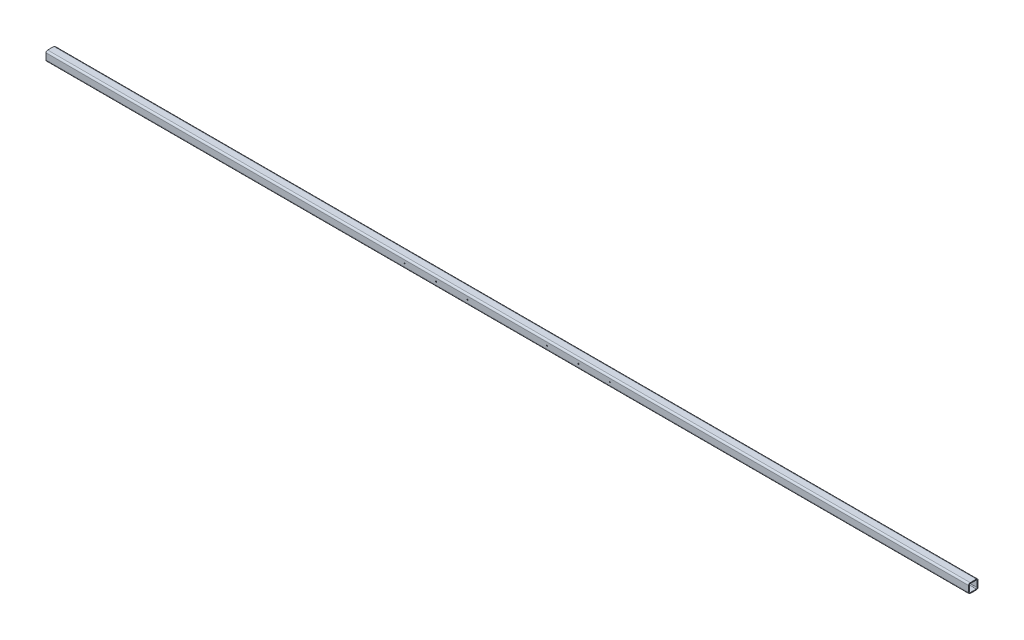
ISO-10303-21;
HEADER;
FILE_DESCRIPTION(('STEP AP214'),'2;1');
FILE_NAME('part.step','',(''),(''),'','','');
FILE_SCHEMA(('AUTOMOTIVE_DESIGN { 1 0 10303 214 1 1 1 1 }'));
ENDSEC;
DATA;
#1=APPLICATION_CONTEXT('core data for automotive mechanical design processes');
#2=APPLICATION_PROTOCOL_DEFINITION('international standard','automotive_design',2000,#1);
#3=PRODUCT_CONTEXT('',#1,'mechanical');
#4=PRODUCT('Part','Part','',(#3));
#5=PRODUCT_RELATED_PRODUCT_CATEGORY('part','',(#4));
#6=PRODUCT_DEFINITION_FORMATION('','',#4);
#7=PRODUCT_DEFINITION_CONTEXT('part definition',#1,'design');
#8=PRODUCT_DEFINITION('design','',#6,#7);
#9=PRODUCT_DEFINITION_SHAPE('','',#8);
#10=(LENGTH_UNIT() NAMED_UNIT(*) SI_UNIT(.MILLI.,.METRE.));
#11=(NAMED_UNIT(*) PLANE_ANGLE_UNIT() SI_UNIT($,.RADIAN.));
#12=(NAMED_UNIT(*) SI_UNIT($,.STERADIAN.) SOLID_ANGLE_UNIT());
#13=UNCERTAINTY_MEASURE_WITH_UNIT(LENGTH_MEASURE(1.E-05),#10,'distance_accuracy_value','');
#14=(GEOMETRIC_REPRESENTATION_CONTEXT(3) GLOBAL_UNCERTAINTY_ASSIGNED_CONTEXT((#13)) GLOBAL_UNIT_ASSIGNED_CONTEXT((#10,
#11,#12)) REPRESENTATION_CONTEXT('',''));
#15=CARTESIAN_POINT('',(0.,0.,0.));
#16=DIRECTION('',(0.,0.,1.));
#17=DIRECTION('',(1.,0.,0.));
#18=AXIS2_PLACEMENT_3D('',#15,#16,#17);
#19=CARTESIAN_POINT('',(2932.,9.8,9.8));
#20=DIRECTION('',(-1.,0.,0.));
#21=DIRECTION('',(0.,0.,1.));
#22=AXIS2_PLACEMENT_3D('',#19,#20,#21);
#23=CYLINDRICAL_SURFACE('',#22,5.2);
#24=CARTESIAN_POINT('',(0.,9.8,9.8));
#25=DIRECTION('',(1.,0.,0.));
#26=DIRECTION('',(0.,0.,-1.));
#27=AXIS2_PLACEMENT_3D('',#24,#25,#26);
#28=CIRCLE('',#27,5.2);
#29=CARTESIAN_POINT('',(0.,15.,9.8));
#30=VERTEX_POINT('',#29);
#31=CARTESIAN_POINT('',(0.,9.8,15.));
#32=VERTEX_POINT('',#31);
#33=EDGE_CURVE('E239',#30,#32,#28,.T.);
#34=ORIENTED_EDGE('',*,*,#33,.T.);
#35=DIRECTION('',(-1.,0.,0.));
#36=VECTOR('',#35,1.);
#37=CARTESIAN_POINT('',(2932.,9.8,15.));
#38=LINE('',#37,#36);
#39=CARTESIAN_POINT('',(2932.,9.8,15.));
#40=VERTEX_POINT('',#39);
#41=EDGE_CURVE('E12',#40,#32,#38,.T.);
#42=ORIENTED_EDGE('',*,*,#41,.F.);
#43=CARTESIAN_POINT('',(2932.,9.8,9.8));
#44=DIRECTION('',(1.,0.,0.));
#45=DIRECTION('',(0.,0.,-1.));
#46=AXIS2_PLACEMENT_3D('',#43,#44,#45);
#47=CIRCLE('',#46,5.2);
#48=CARTESIAN_POINT('',(2932.,15.,9.8));
#49=VERTEX_POINT('',#48);
#50=EDGE_CURVE('E361',#49,#40,#47,.T.);
#51=ORIENTED_EDGE('',*,*,#50,.F.);
#52=DIRECTION('',(-1.,0.,0.));
#53=VECTOR('',#52,1.);
#54=CARTESIAN_POINT('',(2932.,15.,9.8));
#55=LINE('',#54,#53);
#56=EDGE_CURVE('E254',#49,#30,#55,.T.);
#57=ORIENTED_EDGE('',*,*,#56,.T.);
#58=EDGE_LOOP('',(#34,#42,#51,#57));
#59=FACE_BOUND('',#58,.T.);
#60=ADVANCED_FACE('F65',(#59),#23,.T.);
#61=CARTESIAN_POINT('',(2932.,9.8,15.));
#62=DIRECTION('',(0.,0.,-1.));
#63=DIRECTION('',(-1.,0.,0.));
#64=AXIS2_PLACEMENT_3D('',#61,#62,#63);
#65=PLANE('',#64);
#66=CARTESIAN_POINT('',(1139.95,0.,15.));
#67=DIRECTION('',(0.,0.,1.));
#68=DIRECTION('',(1.,0.,0.));
#69=AXIS2_PLACEMENT_3D('',#66,#67,#68);
#70=CIRCLE('',#69,1.64999999999993);
#71=CARTESIAN_POINT('',(1141.6,0.,15.));
#72=VERTEX_POINT('',#71);
#73=EDGE_CURVE('E303',#72,#72,#70,.T.);
#74=ORIENTED_EDGE('',*,*,#73,.F.);
#75=EDGE_LOOP('',(#74));
#76=FACE_BOUND('',#75,.T.);
#77=CARTESIAN_POINT('',(1239.95,0.,15.));
#78=DIRECTION('',(0.,0.,1.));
#79=DIRECTION('',(1.,0.,0.));
#80=AXIS2_PLACEMENT_3D('',#77,#78,#79);
#81=CIRCLE('',#80,1.64999999999993);
#82=CARTESIAN_POINT('',(1241.6,0.,15.));
#83=VERTEX_POINT('',#82);
#84=EDGE_CURVE('E292',#83,#83,#81,.T.);
#85=ORIENTED_EDGE('',*,*,#84,.F.);
#86=EDGE_LOOP('',(#85));
#87=FACE_BOUND('',#86,.T.);
#88=CARTESIAN_POINT('',(1339.95,0.,15.));
#89=DIRECTION('',(0.,0.,1.));
#90=DIRECTION('',(1.,0.,0.));
#91=AXIS2_PLACEMENT_3D('',#88,#89,#90);
#92=CIRCLE('',#91,1.64999999999993);
#93=CARTESIAN_POINT('',(1341.6,0.,15.));
#94=VERTEX_POINT('',#93);
#95=EDGE_CURVE('E291',#94,#94,#92,.T.);
#96=ORIENTED_EDGE('',*,*,#95,.F.);
#97=EDGE_LOOP('',(#96));
#98=FACE_BOUND('',#97,.T.);
#99=CARTESIAN_POINT('',(1592.05,0.,15.));
#100=DIRECTION('',(0.,0.,1.));
#101=DIRECTION('',(1.,0.,0.));
#102=AXIS2_PLACEMENT_3D('',#99,#100,#101);
#103=CIRCLE('',#102,1.64999999999993);
#104=CARTESIAN_POINT('',(1593.7,0.,15.));
#105=VERTEX_POINT('',#104);
#106=EDGE_CURVE('E308',#105,#105,#103,.T.);
#107=ORIENTED_EDGE('',*,*,#106,.F.);
#108=EDGE_LOOP('',(#107));
#109=FACE_BOUND('',#108,.T.);
#110=CARTESIAN_POINT('',(1692.05,0.,15.));
#111=DIRECTION('',(0.,0.,1.));
#112=DIRECTION('',(1.,0.,0.));
#113=AXIS2_PLACEMENT_3D('',#110,#111,#112);
#114=CIRCLE('',#113,1.64999999999993);
#115=CARTESIAN_POINT('',(1693.7,0.,15.));
#116=VERTEX_POINT('',#115);
#117=EDGE_CURVE('E314',#116,#116,#114,.T.);
#118=ORIENTED_EDGE('',*,*,#117,.F.);
#119=EDGE_LOOP('',(#118));
#120=FACE_BOUND('',#119,.T.);
#121=CARTESIAN_POINT('',(1792.05,0.,15.));
#122=DIRECTION('',(0.,0.,1.));
#123=DIRECTION('',(1.,0.,0.));
#124=AXIS2_PLACEMENT_3D('',#121,#122,#123);
#125=CIRCLE('',#124,1.64999999999993);
#126=CARTESIAN_POINT('',(1793.7,0.,15.));
#127=VERTEX_POINT('',#126);
#128=EDGE_CURVE('E320',#127,#127,#125,.T.);
#129=ORIENTED_EDGE('',*,*,#128,.F.);
#130=EDGE_LOOP('',(#129));
#131=FACE_BOUND('',#130,.T.);
#132=DIRECTION('',(0.,-1.,0.));
#133=VECTOR('',#132,1.);
#134=CARTESIAN_POINT('',(0.,9.8,15.));
#135=LINE('',#134,#133);
#136=CARTESIAN_POINT('',(0.,-9.8,15.));
#137=VERTEX_POINT('',#136);
#138=EDGE_CURVE('E242',#32,#137,#135,.T.);
#139=ORIENTED_EDGE('',*,*,#138,.T.);
#140=DIRECTION('',(-1.,0.,0.));
#141=VECTOR('',#140,1.);
#142=CARTESIAN_POINT('',(2932.,-9.8,15.));
#143=LINE('',#142,#141);
#144=CARTESIAN_POINT('',(2932.,-9.8,15.));
#145=VERTEX_POINT('',#144);
#146=EDGE_CURVE('E75',#145,#137,#143,.T.);
#147=ORIENTED_EDGE('',*,*,#146,.F.);
#148=DIRECTION('',(0.,-1.,0.));
#149=VECTOR('',#148,1.);
#150=CARTESIAN_POINT('',(2932.,9.8,15.));
#151=LINE('',#150,#149);
#152=EDGE_CURVE('E363',#40,#145,#151,.T.);
#153=ORIENTED_EDGE('',*,*,#152,.F.);
#154=ORIENTED_EDGE('',*,*,#41,.T.);
#155=EDGE_LOOP('',(#139,#147,#153,#154));
#156=FACE_BOUND('',#155,.T.);
#157=ADVANCED_FACE('F401',(#76,#87,#98,#109,#120,#131,#156),#65,.F.);
#158=CARTESIAN_POINT('',(2932.,-9.8,9.8));
#159=DIRECTION('',(-1.,0.,0.));
#160=DIRECTION('',(0.,0.,1.));
#161=AXIS2_PLACEMENT_3D('',#158,#159,#160);
#162=CYLINDRICAL_SURFACE('',#161,5.2);
#163=CARTESIAN_POINT('',(0.,-9.8,9.8));
#164=DIRECTION('',(1.,0.,0.));
#165=DIRECTION('',(0.,0.,-1.));
#166=AXIS2_PLACEMENT_3D('',#163,#164,#165);
#167=CIRCLE('',#166,5.2);
#168=CARTESIAN_POINT('',(0.,-15.,9.8));
#169=VERTEX_POINT('',#168);
#170=EDGE_CURVE('E244',#137,#169,#167,.T.);
#171=ORIENTED_EDGE('',*,*,#170,.T.);
#172=DIRECTION('',(-1.,0.,0.));
#173=VECTOR('',#172,1.);
#174=CARTESIAN_POINT('',(2932.,-15.,9.8));
#175=LINE('',#174,#173);
#176=CARTESIAN_POINT('',(2932.,-15.,9.8));
#177=VERTEX_POINT('',#176);
#178=EDGE_CURVE('E261',#177,#169,#175,.T.);
#179=ORIENTED_EDGE('',*,*,#178,.F.);
#180=CARTESIAN_POINT('',(2932.,-9.8,9.8));
#181=DIRECTION('',(1.,0.,0.));
#182=DIRECTION('',(0.,0.,-1.));
#183=AXIS2_PLACEMENT_3D('',#180,#181,#182);
#184=CIRCLE('',#183,5.2);
#185=EDGE_CURVE('E365',#145,#177,#184,.T.);
#186=ORIENTED_EDGE('',*,*,#185,.F.);
#187=ORIENTED_EDGE('',*,*,#146,.T.);
#188=EDGE_LOOP('',(#171,#179,#186,#187));
#189=FACE_BOUND('',#188,.T.);
#190=ADVANCED_FACE('F406',(#189),#162,.T.);
#191=CARTESIAN_POINT('',(2932.,-15.,-9.8));
#192=DIRECTION('',(0.,1.,0.));
#193=DIRECTION('',(0.,0.,1.));
#194=AXIS2_PLACEMENT_3D('',#191,#192,#193);
#195=PLANE('',#194);
#196=CARTESIAN_POINT('',(20.9500000000001,-15.,0.));
#197=DIRECTION('',(0.,-1.,0.));
#198=DIRECTION('',(0.,0.,-1.));
#199=AXIS2_PLACEMENT_3D('',#196,#197,#198);
#200=CIRCLE('',#199,1.64999999999999);
#201=CARTESIAN_POINT('',(20.9500000000001,-15.,-1.64999999999999));
#202=VERTEX_POINT('',#201);
#203=EDGE_CURVE('E288',#202,#202,#200,.T.);
#204=ORIENTED_EDGE('',*,*,#203,.F.);
#205=EDGE_LOOP('',(#204));
#206=FACE_BOUND('',#205,.T.);
#207=CARTESIAN_POINT('',(50.9500000000001,-15.,0.));
#208=DIRECTION('',(0.,-1.,0.));
#209=DIRECTION('',(0.,0.,-1.));
#210=AXIS2_PLACEMENT_3D('',#207,#208,#209);
#211=CIRCLE('',#210,1.64999999999999);
#212=CARTESIAN_POINT('',(50.9500000000001,-15.,-1.64999999999999));
#213=VERTEX_POINT('',#212);
#214=EDGE_CURVE('E287',#213,#213,#211,.T.);
#215=ORIENTED_EDGE('',*,*,#214,.F.);
#216=EDGE_LOOP('',(#215));
#217=FACE_BOUND('',#216,.T.);
#218=CARTESIAN_POINT('',(2881.05,-15.,3.46587290626692E-13));
#219=DIRECTION('',(0.,-1.,0.));
#220=DIRECTION('',(0.,0.,-1.));
#221=AXIS2_PLACEMENT_3D('',#218,#219,#220);
#222=CIRCLE('',#221,1.65000000000015);
#223=CARTESIAN_POINT('',(2881.05,-15.,-1.6499999999998));
#224=VERTEX_POINT('',#223);
#225=EDGE_CURVE('E284',#224,#224,#222,.T.);
#226=ORIENTED_EDGE('',*,*,#225,.F.);
#227=EDGE_LOOP('',(#226));
#228=FACE_BOUND('',#227,.T.);
#229=CARTESIAN_POINT('',(2911.05,-15.,3.53935171421577E-13));
#230=DIRECTION('',(0.,-1.,0.));
#231=DIRECTION('',(0.,0.,-1.));
#232=AXIS2_PLACEMENT_3D('',#229,#230,#231);
#233=CIRCLE('',#232,1.65000000000015);
#234=CARTESIAN_POINT('',(2911.05,-15.,-1.6499999999998));
#235=VERTEX_POINT('',#234);
#236=EDGE_CURVE('E283',#235,#235,#233,.T.);
#237=ORIENTED_EDGE('',*,*,#236,.F.);
#238=EDGE_LOOP('',(#237));
#239=FACE_BOUND('',#238,.T.);
#240=DIRECTION('',(0.,0.,-1.));
#241=VECTOR('',#240,1.);
#242=CARTESIAN_POINT('',(0.,-15.,-9.8));
#243=LINE('',#242,#241);
#244=CARTESIAN_POINT('',(0.,-15.,-9.8));
#245=VERTEX_POINT('',#244);
#246=EDGE_CURVE('E246',#169,#245,#243,.T.);
#247=ORIENTED_EDGE('',*,*,#246,.T.);
#248=DIRECTION('',(-1.,0.,0.));
#249=VECTOR('',#248,1.);
#250=CARTESIAN_POINT('',(2932.,-15.,-9.8));
#251=LINE('',#250,#249);
#252=CARTESIAN_POINT('',(2932.,-15.,-9.8));
#253=VERTEX_POINT('',#252);
#254=EDGE_CURVE('E258',#253,#245,#251,.T.);
#255=ORIENTED_EDGE('',*,*,#254,.F.);
#256=DIRECTION('',(0.,0.,-1.));
#257=VECTOR('',#256,1.);
#258=CARTESIAN_POINT('',(2932.,-15.,-9.8));
#259=LINE('',#258,#257);
#260=EDGE_CURVE('E367',#177,#253,#259,.T.);
#261=ORIENTED_EDGE('',*,*,#260,.F.);
#262=ORIENTED_EDGE('',*,*,#178,.T.);
#263=EDGE_LOOP('',(#247,#255,#261,#262));
#264=FACE_BOUND('',#263,.T.);
#265=ADVANCED_FACE('F373',(#206,#217,#228,#239,#264),#195,.F.);
#266=CARTESIAN_POINT('',(2932.,-9.8,-9.8));
#267=DIRECTION('',(-1.,0.,0.));
#268=DIRECTION('',(0.,0.,1.));
#269=AXIS2_PLACEMENT_3D('',#266,#267,#268);
#270=CYLINDRICAL_SURFACE('',#269,5.2);
#271=CARTESIAN_POINT('',(0.,-9.8,-9.8));
#272=DIRECTION('',(1.,0.,0.));
#273=DIRECTION('',(0.,0.,-1.));
#274=AXIS2_PLACEMENT_3D('',#271,#272,#273);
#275=CIRCLE('',#274,5.2);
#276=CARTESIAN_POINT('',(0.,-9.8,-15.));
#277=VERTEX_POINT('',#276);
#278=EDGE_CURVE('E248',#245,#277,#275,.T.);
#279=ORIENTED_EDGE('',*,*,#278,.T.);
#280=DIRECTION('',(-1.,0.,0.));
#281=VECTOR('',#280,1.);
#282=CARTESIAN_POINT('',(2932.,-9.8,-15.));
#283=LINE('',#282,#281);
#284=CARTESIAN_POINT('',(2932.,-9.8,-15.));
#285=VERTEX_POINT('',#284);
#286=EDGE_CURVE('E205',#285,#277,#283,.T.);
#287=ORIENTED_EDGE('',*,*,#286,.F.);
#288=CARTESIAN_POINT('',(2932.,-9.8,-9.8));
#289=DIRECTION('',(1.,0.,0.));
#290=DIRECTION('',(0.,0.,-1.));
#291=AXIS2_PLACEMENT_3D('',#288,#289,#290);
#292=CIRCLE('',#291,5.2);
#293=EDGE_CURVE('E196',#253,#285,#292,.T.);
#294=ORIENTED_EDGE('',*,*,#293,.F.);
#295=ORIENTED_EDGE('',*,*,#254,.T.);
#296=EDGE_LOOP('',(#279,#287,#294,#295));
#297=FACE_BOUND('',#296,.T.);
#298=ADVANCED_FACE('F377',(#297),#270,.T.);
#299=CARTESIAN_POINT('',(2932.,-9.8,-15.));
#300=DIRECTION('',(0.,0.,1.));
#301=DIRECTION('',(1.,0.,0.));
#302=AXIS2_PLACEMENT_3D('',#299,#300,#301);
#303=PLANE('',#302);
#304=DIRECTION('',(0.,1.,0.));
#305=VECTOR('',#304,1.);
#306=CARTESIAN_POINT('',(0.,-9.8,-15.));
#307=LINE('',#306,#305);
#308=CARTESIAN_POINT('',(0.,9.8,-15.));
#309=VERTEX_POINT('',#308);
#310=EDGE_CURVE('E204',#277,#309,#307,.T.);
#311=ORIENTED_EDGE('',*,*,#310,.T.);
#312=DIRECTION('',(-1.,0.,0.));
#313=VECTOR('',#312,1.);
#314=CARTESIAN_POINT('',(2932.,9.8,-15.));
#315=LINE('',#314,#313);
#316=CARTESIAN_POINT('',(2932.,9.8,-15.));
#317=VERTEX_POINT('',#316);
#318=EDGE_CURVE('E201',#317,#309,#315,.T.);
#319=ORIENTED_EDGE('',*,*,#318,.F.);
#320=DIRECTION('',(0.,1.,0.));
#321=VECTOR('',#320,1.);
#322=CARTESIAN_POINT('',(2932.,-9.8,-15.));
#323=LINE('',#322,#321);
#324=EDGE_CURVE('E190',#285,#317,#323,.T.);
#325=ORIENTED_EDGE('',*,*,#324,.F.);
#326=ORIENTED_EDGE('',*,*,#286,.T.);
#327=EDGE_LOOP('',(#311,#319,#325,#326));
#328=FACE_BOUND('',#327,.T.);
#329=ADVANCED_FACE('F202',(#328),#303,.F.);
#330=CARTESIAN_POINT('',(2932.,9.8,-9.8));
#331=DIRECTION('',(-1.,0.,0.));
#332=DIRECTION('',(0.,0.,1.));
#333=AXIS2_PLACEMENT_3D('',#330,#331,#332);
#334=CYLINDRICAL_SURFACE('',#333,5.2);
#335=CARTESIAN_POINT('',(0.,9.8,-9.8));
#336=DIRECTION('',(1.,0.,0.));
#337=DIRECTION('',(0.,0.,-1.));
#338=AXIS2_PLACEMENT_3D('',#335,#336,#337);
#339=CIRCLE('',#338,5.2);
#340=CARTESIAN_POINT('',(0.,15.,-9.8));
#341=VERTEX_POINT('',#340);
#342=EDGE_CURVE('E137',#309,#341,#339,.T.);
#343=ORIENTED_EDGE('',*,*,#342,.T.);
#344=DIRECTION('',(-1.,0.,0.));
#345=VECTOR('',#344,1.);
#346=CARTESIAN_POINT('',(2932.,15.,-9.8));
#347=LINE('',#346,#345);
#348=CARTESIAN_POINT('',(2932.,15.,-9.8));
#349=VERTEX_POINT('',#348);
#350=EDGE_CURVE('E206',#349,#341,#347,.T.);
#351=ORIENTED_EDGE('',*,*,#350,.F.);
#352=CARTESIAN_POINT('',(2932.,9.8,-9.8));
#353=DIRECTION('',(1.,0.,0.));
#354=DIRECTION('',(0.,0.,-1.));
#355=AXIS2_PLACEMENT_3D('',#352,#353,#354);
#356=CIRCLE('',#355,5.2);
#357=EDGE_CURVE('E194',#317,#349,#356,.T.);
#358=ORIENTED_EDGE('',*,*,#357,.F.);
#359=ORIENTED_EDGE('',*,*,#318,.T.);
#360=EDGE_LOOP('',(#343,#351,#358,#359));
#361=FACE_BOUND('',#360,.T.);
#362=ADVANCED_FACE('F208',(#361),#334,.T.);
#363=CARTESIAN_POINT('',(2932.,-9.8,9.8));
#364=DIRECTION('',(-1.,0.,0.));
#365=DIRECTION('',(0.,0.,1.));
#366=AXIS2_PLACEMENT_3D('',#363,#364,#365);
#367=CYLINDRICAL_SURFACE('',#366,2.6);
#368=CARTESIAN_POINT('',(0.,-9.8,9.8));
#369=DIRECTION('',(1.,0.,0.));
#370=DIRECTION('',(0.,0.,-1.));
#371=AXIS2_PLACEMENT_3D('',#368,#369,#370);
#372=CIRCLE('',#371,2.6);
#373=CARTESIAN_POINT('',(0.,-9.8,12.4));
#374=VERTEX_POINT('',#373);
#375=CARTESIAN_POINT('',(0.,-12.4,9.8));
#376=VERTEX_POINT('',#375);
#377=EDGE_CURVE('E214',#374,#376,#372,.T.);
#378=ORIENTED_EDGE('',*,*,#377,.F.);
#379=DIRECTION('',(-1.,0.,0.));
#380=VECTOR('',#379,1.);
#381=CARTESIAN_POINT('',(2932.,-9.8,12.4));
#382=LINE('',#381,#380);
#383=CARTESIAN_POINT('',(2932.,-9.8,12.4));
#384=VERTEX_POINT('',#383);
#385=EDGE_CURVE('E151',#384,#374,#382,.T.);
#386=ORIENTED_EDGE('',*,*,#385,.F.);
#387=CARTESIAN_POINT('',(2932.,-9.8,9.8));
#388=DIRECTION('',(1.,0.,0.));
#389=DIRECTION('',(0.,0.,-1.));
#390=AXIS2_PLACEMENT_3D('',#387,#388,#389);
#391=CIRCLE('',#390,2.6);
#392=CARTESIAN_POINT('',(2932.,-12.4,9.8));
#393=VERTEX_POINT('',#392);
#394=EDGE_CURVE('E253',#384,#393,#391,.T.);
#395=ORIENTED_EDGE('',*,*,#394,.T.);
#396=DIRECTION('',(-1.,0.,0.));
#397=VECTOR('',#396,1.);
#398=CARTESIAN_POINT('',(2932.,-12.4,9.8));
#399=LINE('',#398,#397);
#400=EDGE_CURVE('E210',#393,#376,#399,.T.);
#401=ORIENTED_EDGE('',*,*,#400,.T.);
#402=EDGE_LOOP('',(#378,#386,#395,#401));
#403=FACE_BOUND('',#402,.T.);
#404=ADVANCED_FACE('F67',(#403),#367,.F.);
#405=CARTESIAN_POINT('',(2932.,9.8,12.4));
#406=DIRECTION('',(0.,0.,-1.));
#407=DIRECTION('',(-1.,0.,0.));
#408=AXIS2_PLACEMENT_3D('',#405,#406,#407);
#409=PLANE('',#408);
#410=CARTESIAN_POINT('',(1139.95,0.,12.4));
#411=DIRECTION('',(0.,0.,-1.));
#412=DIRECTION('',(-1.,0.,0.));
#413=AXIS2_PLACEMENT_3D('',#410,#411,#412);
#414=CIRCLE('',#413,1.64999999999993);
#415=CARTESIAN_POINT('',(1138.3,0.,12.4));
#416=VERTEX_POINT('',#415);
#417=EDGE_CURVE('E69',#416,#416,#414,.T.);
#418=ORIENTED_EDGE('',*,*,#417,.F.);
#419=EDGE_LOOP('',(#418));
#420=FACE_BOUND('',#419,.T.);
#421=CARTESIAN_POINT('',(1239.95,0.,12.4));
#422=DIRECTION('',(0.,0.,-1.));
#423=DIRECTION('',(-1.,0.,0.));
#424=AXIS2_PLACEMENT_3D('',#421,#422,#423);
#425=CIRCLE('',#424,1.64999999999993);
#426=CARTESIAN_POINT('',(1238.3,0.,12.4));
#427=VERTEX_POINT('',#426);
#428=EDGE_CURVE('E289',#427,#427,#425,.T.);
#429=ORIENTED_EDGE('',*,*,#428,.F.);
#430=EDGE_LOOP('',(#429));
#431=FACE_BOUND('',#430,.T.);
#432=CARTESIAN_POINT('',(1339.95,0.,12.4));
#433=DIRECTION('',(0.,0.,-1.));
#434=DIRECTION('',(-1.,0.,0.));
#435=AXIS2_PLACEMENT_3D('',#432,#433,#434);
#436=CIRCLE('',#435,1.64999999999993);
#437=CARTESIAN_POINT('',(1338.3,0.,12.4));
#438=VERTEX_POINT('',#437);
#439=EDGE_CURVE('E296',#438,#438,#436,.T.);
#440=ORIENTED_EDGE('',*,*,#439,.F.);
#441=EDGE_LOOP('',(#440));
#442=FACE_BOUND('',#441,.T.);
#443=CARTESIAN_POINT('',(1592.05,0.,12.4));
#444=DIRECTION('',(0.,0.,-1.));
#445=DIRECTION('',(-1.,0.,0.));
#446=AXIS2_PLACEMENT_3D('',#443,#444,#445);
#447=CIRCLE('',#446,1.64999999999993);
#448=CARTESIAN_POINT('',(1590.4,0.,12.4));
#449=VERTEX_POINT('',#448);
#450=EDGE_CURVE('E311',#449,#449,#447,.T.);
#451=ORIENTED_EDGE('',*,*,#450,.F.);
#452=EDGE_LOOP('',(#451));
#453=FACE_BOUND('',#452,.T.);
#454=CARTESIAN_POINT('',(1692.05,0.,12.4));
#455=DIRECTION('',(0.,0.,-1.));
#456=DIRECTION('',(-1.,0.,0.));
#457=AXIS2_PLACEMENT_3D('',#454,#455,#456);
#458=CIRCLE('',#457,1.64999999999993);
#459=CARTESIAN_POINT('',(1690.4,0.,12.4));
#460=VERTEX_POINT('',#459);
#461=EDGE_CURVE('E317',#460,#460,#458,.T.);
#462=ORIENTED_EDGE('',*,*,#461,.F.);
#463=EDGE_LOOP('',(#462));
#464=FACE_BOUND('',#463,.T.);
#465=CARTESIAN_POINT('',(1792.05,0.,12.4));
#466=DIRECTION('',(0.,0.,-1.));
#467=DIRECTION('',(-1.,0.,0.));
#468=AXIS2_PLACEMENT_3D('',#465,#466,#467);
#469=CIRCLE('',#468,1.64999999999993);
#470=CARTESIAN_POINT('',(1790.4,0.,12.4));
#471=VERTEX_POINT('',#470);
#472=EDGE_CURVE('E323',#471,#471,#469,.T.);
#473=ORIENTED_EDGE('',*,*,#472,.F.);
#474=EDGE_LOOP('',(#473));
#475=FACE_BOUND('',#474,.T.);
#476=DIRECTION('',(0.,-1.,0.));
#477=VECTOR('',#476,1.);
#478=CARTESIAN_POINT('',(0.,9.8,12.4));
#479=LINE('',#478,#477);
#480=CARTESIAN_POINT('',(0.,9.8,12.4));
#481=VERTEX_POINT('',#480);
#482=EDGE_CURVE('E217',#481,#374,#479,.T.);
#483=ORIENTED_EDGE('',*,*,#482,.F.);
#484=DIRECTION('',(-1.,0.,0.));
#485=VECTOR('',#484,1.);
#486=CARTESIAN_POINT('',(2932.,9.8,12.4));
#487=LINE('',#486,#485);
#488=CARTESIAN_POINT('',(2932.,9.8,12.4));
#489=VERTEX_POINT('',#488);
#490=EDGE_CURVE('E277',#489,#481,#487,.T.);
#491=ORIENTED_EDGE('',*,*,#490,.F.);
#492=DIRECTION('',(0.,-1.,0.));
#493=VECTOR('',#492,1.);
#494=CARTESIAN_POINT('',(2932.,9.8,12.4));
#495=LINE('',#494,#493);
#496=EDGE_CURVE('E340',#489,#384,#495,.T.);
#497=ORIENTED_EDGE('',*,*,#496,.T.);
#498=ORIENTED_EDGE('',*,*,#385,.T.);
#499=EDGE_LOOP('',(#483,#491,#497,#498));
#500=FACE_BOUND('',#499,.T.);
#501=ADVANCED_FACE('F428',(#420,#431,#442,#453,#464,#475,#500),#409,.T.);
#502=CARTESIAN_POINT('',(2932.,9.8,9.8));
#503=DIRECTION('',(-1.,0.,0.));
#504=DIRECTION('',(0.,0.,1.));
#505=AXIS2_PLACEMENT_3D('',#502,#503,#504);
#506=CYLINDRICAL_SURFACE('',#505,2.6);
#507=CARTESIAN_POINT('',(0.,9.8,9.8));
#508=DIRECTION('',(1.,0.,0.));
#509=DIRECTION('',(0.,0.,-1.));
#510=AXIS2_PLACEMENT_3D('',#507,#508,#509);
#511=CIRCLE('',#510,2.6);
#512=CARTESIAN_POINT('',(0.,12.4,9.8));
#513=VERTEX_POINT('',#512);
#514=EDGE_CURVE('E221',#513,#481,#511,.T.);
#515=ORIENTED_EDGE('',*,*,#514,.F.);
#516=DIRECTION('',(-1.,0.,0.));
#517=VECTOR('',#516,1.);
#518=CARTESIAN_POINT('',(2932.,12.4,9.8));
#519=LINE('',#518,#517);
#520=CARTESIAN_POINT('',(2932.,12.4,9.8));
#521=VERTEX_POINT('',#520);
#522=EDGE_CURVE('E275',#521,#513,#519,.T.);
#523=ORIENTED_EDGE('',*,*,#522,.F.);
#524=CARTESIAN_POINT('',(2932.,9.8,9.8));
#525=DIRECTION('',(1.,0.,0.));
#526=DIRECTION('',(0.,0.,-1.));
#527=AXIS2_PLACEMENT_3D('',#524,#525,#526);
#528=CIRCLE('',#527,2.6);
#529=EDGE_CURVE('E343',#521,#489,#528,.T.);
#530=ORIENTED_EDGE('',*,*,#529,.T.);
#531=ORIENTED_EDGE('',*,*,#490,.T.);
#532=EDGE_LOOP('',(#515,#523,#530,#531));
#533=FACE_BOUND('',#532,.T.);
#534=ADVANCED_FACE('F425',(#533),#506,.F.);
#535=CARTESIAN_POINT('',(2932.,12.4,9.8));
#536=DIRECTION('',(0.,-1.,0.));
#537=DIRECTION('',(0.,0.,-1.));
#538=AXIS2_PLACEMENT_3D('',#535,#536,#537);
#539=PLANE('',#538);
#540=DIRECTION('',(0.,0.,1.));
#541=VECTOR('',#540,1.);
#542=CARTESIAN_POINT('',(0.,12.4,9.8));
#543=LINE('',#542,#541);
#544=CARTESIAN_POINT('',(0.,12.4,-9.8));
#545=VERTEX_POINT('',#544);
#546=EDGE_CURVE('E224',#545,#513,#543,.T.);
#547=ORIENTED_EDGE('',*,*,#546,.F.);
#548=DIRECTION('',(-1.,0.,0.));
#549=VECTOR('',#548,1.);
#550=CARTESIAN_POINT('',(2932.,12.4,-9.8));
#551=LINE('',#550,#549);
#552=CARTESIAN_POINT('',(2932.,12.4,-9.8));
#553=VERTEX_POINT('',#552);
#554=EDGE_CURVE('E273',#553,#545,#551,.T.);
#555=ORIENTED_EDGE('',*,*,#554,.F.);
#556=DIRECTION('',(0.,0.,1.));
#557=VECTOR('',#556,1.);
#558=CARTESIAN_POINT('',(2932.,12.4,9.8));
#559=LINE('',#558,#557);
#560=EDGE_CURVE('E346',#553,#521,#559,.T.);
#561=ORIENTED_EDGE('',*,*,#560,.T.);
#562=ORIENTED_EDGE('',*,*,#522,.T.);
#563=EDGE_LOOP('',(#547,#555,#561,#562));
#564=FACE_BOUND('',#563,.T.);
#565=ADVANCED_FACE('F421',(#564),#539,.T.);
#566=CARTESIAN_POINT('',(2932.,9.8,-9.8));
#567=DIRECTION('',(-1.,0.,0.));
#568=DIRECTION('',(0.,0.,1.));
#569=AXIS2_PLACEMENT_3D('',#566,#567,#568);
#570=CYLINDRICAL_SURFACE('',#569,2.6);
#571=CARTESIAN_POINT('',(0.,9.8,-9.8));
#572=DIRECTION('',(1.,0.,0.));
#573=DIRECTION('',(0.,0.,-1.));
#574=AXIS2_PLACEMENT_3D('',#571,#572,#573);
#575=CIRCLE('',#574,2.6);
#576=CARTESIAN_POINT('',(0.,9.8,-12.4));
#577=VERTEX_POINT('',#576);
#578=EDGE_CURVE('E227',#577,#545,#575,.T.);
#579=ORIENTED_EDGE('',*,*,#578,.F.);
#580=DIRECTION('',(-1.,0.,0.));
#581=VECTOR('',#580,1.);
#582=CARTESIAN_POINT('',(2932.,9.8,-12.4));
#583=LINE('',#582,#581);
#584=CARTESIAN_POINT('',(2932.,9.8,-12.4));
#585=VERTEX_POINT('',#584);
#586=EDGE_CURVE('E271',#585,#577,#583,.T.);
#587=ORIENTED_EDGE('',*,*,#586,.F.);
#588=CARTESIAN_POINT('',(2932.,9.8,-9.8));
#589=DIRECTION('',(1.,0.,0.));
#590=DIRECTION('',(0.,0.,-1.));
#591=AXIS2_PLACEMENT_3D('',#588,#589,#590);
#592=CIRCLE('',#591,2.6);
#593=EDGE_CURVE('E349',#585,#553,#592,.T.);
#594=ORIENTED_EDGE('',*,*,#593,.T.);
#595=ORIENTED_EDGE('',*,*,#554,.T.);
#596=EDGE_LOOP('',(#579,#587,#594,#595));
#597=FACE_BOUND('',#596,.T.);
#598=ADVANCED_FACE('F417',(#597),#570,.F.);
#599=CARTESIAN_POINT('',(2932.,-9.8,-12.4));
#600=DIRECTION('',(0.,0.,1.));
#601=DIRECTION('',(1.,0.,0.));
#602=AXIS2_PLACEMENT_3D('',#599,#600,#601);
#603=PLANE('',#602);
#604=DIRECTION('',(0.,1.,0.));
#605=VECTOR('',#604,1.);
#606=CARTESIAN_POINT('',(0.,-9.8,-12.4));
#607=LINE('',#606,#605);
#608=CARTESIAN_POINT('',(0.,-9.8,-12.4));
#609=VERTEX_POINT('',#608);
#610=EDGE_CURVE('E230',#609,#577,#607,.T.);
#611=ORIENTED_EDGE('',*,*,#610,.F.);
#612=DIRECTION('',(-1.,0.,0.));
#613=VECTOR('',#612,1.);
#614=CARTESIAN_POINT('',(2932.,-9.8,-12.4));
#615=LINE('',#614,#613);
#616=CARTESIAN_POINT('',(2932.,-9.8,-12.4));
#617=VERTEX_POINT('',#616);
#618=EDGE_CURVE('E269',#617,#609,#615,.T.);
#619=ORIENTED_EDGE('',*,*,#618,.F.);
#620=DIRECTION('',(0.,1.,0.));
#621=VECTOR('',#620,1.);
#622=CARTESIAN_POINT('',(2932.,-9.8,-12.4));
#623=LINE('',#622,#621);
#624=EDGE_CURVE('E352',#617,#585,#623,.T.);
#625=ORIENTED_EDGE('',*,*,#624,.T.);
#626=ORIENTED_EDGE('',*,*,#586,.T.);
#627=EDGE_LOOP('',(#611,#619,#625,#626));
#628=FACE_BOUND('',#627,.T.);
#629=ADVANCED_FACE('F413',(#628),#603,.T.);
#630=CARTESIAN_POINT('',(2932.,-9.8,-9.8));
#631=DIRECTION('',(-1.,0.,0.));
#632=DIRECTION('',(0.,0.,1.));
#633=AXIS2_PLACEMENT_3D('',#630,#631,#632);
#634=CYLINDRICAL_SURFACE('',#633,2.6);
#635=CARTESIAN_POINT('',(0.,-9.8,-9.8));
#636=DIRECTION('',(1.,0.,0.));
#637=DIRECTION('',(0.,0.,-1.));
#638=AXIS2_PLACEMENT_3D('',#635,#636,#637);
#639=CIRCLE('',#638,2.6);
#640=CARTESIAN_POINT('',(0.,-12.4,-9.8));
#641=VERTEX_POINT('',#640);
#642=EDGE_CURVE('E233',#641,#609,#639,.T.);
#643=ORIENTED_EDGE('',*,*,#642,.F.);
#644=DIRECTION('',(-1.,0.,0.));
#645=VECTOR('',#644,1.);
#646=CARTESIAN_POINT('',(2932.,-12.4,-9.8));
#647=LINE('',#646,#645);
#648=CARTESIAN_POINT('',(2932.,-12.4,-9.8));
#649=VERTEX_POINT('',#648);
#650=EDGE_CURVE('E267',#649,#641,#647,.T.);
#651=ORIENTED_EDGE('',*,*,#650,.F.);
#652=CARTESIAN_POINT('',(2932.,-9.8,-9.8));
#653=DIRECTION('',(1.,0.,0.));
#654=DIRECTION('',(0.,0.,-1.));
#655=AXIS2_PLACEMENT_3D('',#652,#653,#654);
#656=CIRCLE('',#655,2.6);
#657=EDGE_CURVE('E355',#649,#617,#656,.T.);
#658=ORIENTED_EDGE('',*,*,#657,.T.);
#659=ORIENTED_EDGE('',*,*,#618,.T.);
#660=EDGE_LOOP('',(#643,#651,#658,#659));
#661=FACE_BOUND('',#660,.T.);
#662=ADVANCED_FACE('F395',(#661),#634,.F.);
#663=CARTESIAN_POINT('',(2932.,-12.4,-9.8));
#664=DIRECTION('',(0.,1.,0.));
#665=DIRECTION('',(0.,0.,1.));
#666=AXIS2_PLACEMENT_3D('',#663,#664,#665);
#667=PLANE('',#666);
#668=CARTESIAN_POINT('',(20.9500000000001,-12.4,0.));
#669=DIRECTION('',(0.,1.,0.));
#670=DIRECTION('',(0.,0.,1.));
#671=AXIS2_PLACEMENT_3D('',#668,#669,#670);
#672=CIRCLE('',#671,1.64999999999999);
#673=CARTESIAN_POINT('',(20.9500000000001,-12.4,1.64999999999999));
#674=VERTEX_POINT('',#673);
#675=EDGE_CURVE('E285',#674,#674,#672,.T.);
#676=ORIENTED_EDGE('',*,*,#675,.F.);
#677=EDGE_LOOP('',(#676));
#678=FACE_BOUND('',#677,.T.);
#679=CARTESIAN_POINT('',(50.9500000000001,-12.4,0.));
#680=DIRECTION('',(0.,1.,0.));
#681=DIRECTION('',(0.,0.,1.));
#682=AXIS2_PLACEMENT_3D('',#679,#680,#681);
#683=CIRCLE('',#682,1.64999999999999);
#684=CARTESIAN_POINT('',(50.9500000000001,-12.4,1.64999999999999));
#685=VERTEX_POINT('',#684);
#686=EDGE_CURVE('E330',#685,#685,#683,.T.);
#687=ORIENTED_EDGE('',*,*,#686,.F.);
#688=EDGE_LOOP('',(#687));
#689=FACE_BOUND('',#688,.T.);
#690=CARTESIAN_POINT('',(2881.05,-12.4,3.46587290626692E-13));
#691=DIRECTION('',(0.,1.,0.));
#692=DIRECTION('',(0.,0.,1.));
#693=AXIS2_PLACEMENT_3D('',#690,#691,#692);
#694=CIRCLE('',#693,1.65000000000015);
#695=CARTESIAN_POINT('',(2881.05,-12.4,1.6500000000005));
#696=VERTEX_POINT('',#695);
#697=EDGE_CURVE('E280',#696,#696,#694,.T.);
#698=ORIENTED_EDGE('',*,*,#697,.F.);
#699=EDGE_LOOP('',(#698));
#700=FACE_BOUND('',#699,.T.);
#701=CARTESIAN_POINT('',(2911.05,-12.4,3.53935171421577E-13));
#702=DIRECTION('',(0.,1.,0.));
#703=DIRECTION('',(0.,0.,1.));
#704=AXIS2_PLACEMENT_3D('',#701,#702,#703);
#705=CIRCLE('',#704,1.65000000000015);
#706=CARTESIAN_POINT('',(2911.05,-12.4,1.65000000000051));
#707=VERTEX_POINT('',#706);
#708=EDGE_CURVE('E218',#707,#707,#705,.T.);
#709=ORIENTED_EDGE('',*,*,#708,.F.);
#710=EDGE_LOOP('',(#709));
#711=FACE_BOUND('',#710,.T.);
#712=DIRECTION('',(0.,0.,-1.));
#713=VECTOR('',#712,1.);
#714=CARTESIAN_POINT('',(0.,-12.4,-9.8));
#715=LINE('',#714,#713);
#716=EDGE_CURVE('E236',#376,#641,#715,.T.);
#717=ORIENTED_EDGE('',*,*,#716,.F.);
#718=ORIENTED_EDGE('',*,*,#400,.F.);
#719=DIRECTION('',(0.,0.,-1.));
#720=VECTOR('',#719,1.);
#721=CARTESIAN_POINT('',(2932.,-12.4,-9.8));
#722=LINE('',#721,#720);
#723=EDGE_CURVE('E358',#393,#649,#722,.T.);
#724=ORIENTED_EDGE('',*,*,#723,.T.);
#725=ORIENTED_EDGE('',*,*,#650,.T.);
#726=EDGE_LOOP('',(#717,#718,#724,#725));
#727=FACE_BOUND('',#726,.T.);
#728=ADVANCED_FACE('F387',(#678,#689,#700,#711,#727),#667,.T.);
#729=CARTESIAN_POINT('',(2932.,15.,9.8));
#730=DIRECTION('',(0.,-1.,0.));
#731=DIRECTION('',(0.,0.,-1.));
#732=AXIS2_PLACEMENT_3D('',#729,#730,#731);
#733=PLANE('',#732);
#734=DIRECTION('',(0.,0.,1.));
#735=VECTOR('',#734,1.);
#736=CARTESIAN_POINT('',(0.,15.,9.8));
#737=LINE('',#736,#735);
#738=EDGE_CURVE('E143',#341,#30,#737,.T.);
#739=ORIENTED_EDGE('',*,*,#738,.T.);
#740=ORIENTED_EDGE('',*,*,#56,.F.);
#741=DIRECTION('',(0.,0.,1.));
#742=VECTOR('',#741,1.);
#743=CARTESIAN_POINT('',(2932.,15.,9.8));
#744=LINE('',#743,#742);
#745=EDGE_CURVE('E84',#349,#49,#744,.T.);
#746=ORIENTED_EDGE('',*,*,#745,.F.);
#747=ORIENTED_EDGE('',*,*,#350,.T.);
#748=EDGE_LOOP('',(#739,#740,#746,#747));
#749=FACE_BOUND('',#748,.T.);
#750=ADVANCED_FACE('F385',(#749),#733,.F.);
#751=CARTESIAN_POINT('',(2932.,9.8,9.8));
#752=DIRECTION('',(1.,0.,0.));
#753=DIRECTION('',(0.,0.,-1.));
#754=AXIS2_PLACEMENT_3D('',#751,#752,#753);
#755=PLANE('',#754);
#756=ORIENTED_EDGE('',*,*,#394,.F.);
#757=ORIENTED_EDGE('',*,*,#496,.F.);
#758=ORIENTED_EDGE('',*,*,#529,.F.);
#759=ORIENTED_EDGE('',*,*,#560,.F.);
#760=ORIENTED_EDGE('',*,*,#593,.F.);
#761=ORIENTED_EDGE('',*,*,#624,.F.);
#762=ORIENTED_EDGE('',*,*,#657,.F.);
#763=ORIENTED_EDGE('',*,*,#723,.F.);
#764=EDGE_LOOP('',(#756,#757,#758,#759,#760,#761,#762,#763));
#765=FACE_BOUND('',#764,.T.);
#766=ORIENTED_EDGE('',*,*,#50,.T.);
#767=ORIENTED_EDGE('',*,*,#152,.T.);
#768=ORIENTED_EDGE('',*,*,#185,.T.);
#769=ORIENTED_EDGE('',*,*,#260,.T.);
#770=ORIENTED_EDGE('',*,*,#293,.T.);
#771=ORIENTED_EDGE('',*,*,#324,.T.);
#772=ORIENTED_EDGE('',*,*,#357,.T.);
#773=ORIENTED_EDGE('',*,*,#745,.T.);
#774=EDGE_LOOP('',(#766,#767,#768,#769,#770,#771,#772,#773));
#775=FACE_BOUND('',#774,.T.);
#776=ADVANCED_FACE('F192',(#765,#775),#755,.T.);
#777=CARTESIAN_POINT('',(0.,9.8,9.8));
#778=DIRECTION('',(1.,0.,0.));
#779=DIRECTION('',(0.,0.,-1.));
#780=AXIS2_PLACEMENT_3D('',#777,#778,#779);
#781=PLANE('',#780);
#782=ORIENTED_EDGE('',*,*,#377,.T.);
#783=ORIENTED_EDGE('',*,*,#716,.T.);
#784=ORIENTED_EDGE('',*,*,#642,.T.);
#785=ORIENTED_EDGE('',*,*,#610,.T.);
#786=ORIENTED_EDGE('',*,*,#578,.T.);
#787=ORIENTED_EDGE('',*,*,#546,.T.);
#788=ORIENTED_EDGE('',*,*,#514,.T.);
#789=ORIENTED_EDGE('',*,*,#482,.T.);
#790=EDGE_LOOP('',(#782,#783,#784,#785,#786,#787,#788,#789));
#791=FACE_BOUND('',#790,.T.);
#792=ORIENTED_EDGE('',*,*,#33,.F.);
#793=ORIENTED_EDGE('',*,*,#738,.F.);
#794=ORIENTED_EDGE('',*,*,#342,.F.);
#795=ORIENTED_EDGE('',*,*,#310,.F.);
#796=ORIENTED_EDGE('',*,*,#278,.F.);
#797=ORIENTED_EDGE('',*,*,#246,.F.);
#798=ORIENTED_EDGE('',*,*,#170,.F.);
#799=ORIENTED_EDGE('',*,*,#138,.F.);
#800=EDGE_LOOP('',(#792,#793,#794,#795,#796,#797,#798,#799));
#801=FACE_BOUND('',#800,.T.);
#802=ADVANCED_FACE('F380',(#791,#801),#781,.F.);
#803=CARTESIAN_POINT('',(2911.05,-15.,3.53935171421577E-13));
#804=DIRECTION('',(0.,-1.,0.));
#805=DIRECTION('',(0.,0.,-1.));
#806=AXIS2_PLACEMENT_3D('',#803,#804,#805);
#807=CYLINDRICAL_SURFACE('',#806,1.65000000000015);
#808=ORIENTED_EDGE('',*,*,#708,.T.);
#809=EDGE_LOOP('',(#808));
#810=FACE_BOUND('',#809,.T.);
#811=ORIENTED_EDGE('',*,*,#236,.T.);
#812=EDGE_LOOP('',(#811));
#813=FACE_BOUND('',#812,.T.);
#814=ADVANCED_FACE('F463',(#810,#813),#807,.F.);
#815=CARTESIAN_POINT('',(2881.05,-15.,3.46587290626692E-13));
#816=DIRECTION('',(0.,-1.,0.));
#817=DIRECTION('',(0.,0.,-1.));
#818=AXIS2_PLACEMENT_3D('',#815,#816,#817);
#819=CYLINDRICAL_SURFACE('',#818,1.65000000000015);
#820=ORIENTED_EDGE('',*,*,#697,.T.);
#821=EDGE_LOOP('',(#820));
#822=FACE_BOUND('',#821,.T.);
#823=ORIENTED_EDGE('',*,*,#225,.T.);
#824=EDGE_LOOP('',(#823));
#825=FACE_BOUND('',#824,.T.);
#826=ADVANCED_FACE('F467',(#822,#825),#819,.F.);
#827=CARTESIAN_POINT('',(50.9500000000001,-15.,0.));
#828=DIRECTION('',(0.,-1.,0.));
#829=DIRECTION('',(0.,0.,-1.));
#830=AXIS2_PLACEMENT_3D('',#827,#828,#829);
#831=CYLINDRICAL_SURFACE('',#830,1.64999999999999);
#832=ORIENTED_EDGE('',*,*,#686,.T.);
#833=EDGE_LOOP('',(#832));
#834=FACE_BOUND('',#833,.T.);
#835=ORIENTED_EDGE('',*,*,#214,.T.);
#836=EDGE_LOOP('',(#835));
#837=FACE_BOUND('',#836,.T.);
#838=ADVANCED_FACE('F473',(#834,#837),#831,.F.);
#839=CARTESIAN_POINT('',(20.9500000000001,-15.,0.));
#840=DIRECTION('',(0.,-1.,0.));
#841=DIRECTION('',(0.,0.,-1.));
#842=AXIS2_PLACEMENT_3D('',#839,#840,#841);
#843=CYLINDRICAL_SURFACE('',#842,1.64999999999999);
#844=ORIENTED_EDGE('',*,*,#675,.T.);
#845=EDGE_LOOP('',(#844));
#846=FACE_BOUND('',#845,.T.);
#847=ORIENTED_EDGE('',*,*,#203,.T.);
#848=EDGE_LOOP('',(#847));
#849=FACE_BOUND('',#848,.T.);
#850=ADVANCED_FACE('F477',(#846,#849),#843,.F.);
#851=CARTESIAN_POINT('',(1792.05,0.,15.));
#852=DIRECTION('',(0.,0.,1.));
#853=DIRECTION('',(1.,0.,0.));
#854=AXIS2_PLACEMENT_3D('',#851,#852,#853);
#855=CYLINDRICAL_SURFACE('',#854,1.64999999999993);
#856=ORIENTED_EDGE('',*,*,#472,.T.);
#857=EDGE_LOOP('',(#856));
#858=FACE_BOUND('',#857,.T.);
#859=ORIENTED_EDGE('',*,*,#128,.T.);
#860=EDGE_LOOP('',(#859));
#861=FACE_BOUND('',#860,.T.);
#862=ADVANCED_FACE('F481',(#858,#861),#855,.F.);
#863=CARTESIAN_POINT('',(1692.05,0.,15.));
#864=DIRECTION('',(0.,0.,1.));
#865=DIRECTION('',(1.,0.,0.));
#866=AXIS2_PLACEMENT_3D('',#863,#864,#865);
#867=CYLINDRICAL_SURFACE('',#866,1.64999999999993);
#868=ORIENTED_EDGE('',*,*,#461,.T.);
#869=EDGE_LOOP('',(#868));
#870=FACE_BOUND('',#869,.T.);
#871=ORIENTED_EDGE('',*,*,#117,.T.);
#872=EDGE_LOOP('',(#871));
#873=FACE_BOUND('',#872,.T.);
#874=ADVANCED_FACE('F485',(#870,#873),#867,.F.);
#875=CARTESIAN_POINT('',(1592.05,0.,15.));
#876=DIRECTION('',(0.,0.,1.));
#877=DIRECTION('',(1.,0.,0.));
#878=AXIS2_PLACEMENT_3D('',#875,#876,#877);
#879=CYLINDRICAL_SURFACE('',#878,1.64999999999993);
#880=ORIENTED_EDGE('',*,*,#450,.T.);
#881=EDGE_LOOP('',(#880));
#882=FACE_BOUND('',#881,.T.);
#883=ORIENTED_EDGE('',*,*,#106,.T.);
#884=EDGE_LOOP('',(#883));
#885=FACE_BOUND('',#884,.T.);
#886=ADVANCED_FACE('F489',(#882,#885),#879,.F.);
#887=CARTESIAN_POINT('',(1339.95,0.,15.));
#888=DIRECTION('',(0.,0.,1.));
#889=DIRECTION('',(1.,0.,0.));
#890=AXIS2_PLACEMENT_3D('',#887,#888,#889);
#891=CYLINDRICAL_SURFACE('',#890,1.64999999999993);
#892=ORIENTED_EDGE('',*,*,#439,.T.);
#893=EDGE_LOOP('',(#892));
#894=FACE_BOUND('',#893,.T.);
#895=ORIENTED_EDGE('',*,*,#95,.T.);
#896=EDGE_LOOP('',(#895));
#897=FACE_BOUND('',#896,.T.);
#898=ADVANCED_FACE('F493',(#894,#897),#891,.F.);
#899=CARTESIAN_POINT('',(1239.95,0.,15.));
#900=DIRECTION('',(0.,0.,1.));
#901=DIRECTION('',(1.,0.,0.));
#902=AXIS2_PLACEMENT_3D('',#899,#900,#901);
#903=CYLINDRICAL_SURFACE('',#902,1.64999999999993);
#904=ORIENTED_EDGE('',*,*,#428,.T.);
#905=EDGE_LOOP('',(#904));
#906=FACE_BOUND('',#905,.T.);
#907=ORIENTED_EDGE('',*,*,#84,.T.);
#908=EDGE_LOOP('',(#907));
#909=FACE_BOUND('',#908,.T.);
#910=ADVANCED_FACE('F497',(#906,#909),#903,.F.);
#911=CARTESIAN_POINT('',(1139.95,0.,15.));
#912=DIRECTION('',(0.,0.,1.));
#913=DIRECTION('',(1.,0.,0.));
#914=AXIS2_PLACEMENT_3D('',#911,#912,#913);
#915=CYLINDRICAL_SURFACE('',#914,1.64999999999993);
#916=ORIENTED_EDGE('',*,*,#417,.T.);
#917=EDGE_LOOP('',(#916));
#918=FACE_BOUND('',#917,.T.);
#919=ORIENTED_EDGE('',*,*,#73,.T.);
#920=EDGE_LOOP('',(#919));
#921=FACE_BOUND('',#920,.T.);
#922=ADVANCED_FACE('F501',(#918,#921),#915,.F.);
#923=CLOSED_SHELL('',(#60,#157,#190,#265,#298,#329,#362,#404,#501,#534,#565,#598,#629,#662,#728,
#750,#776,#802,#814,#826,#838,#850,#862,#874,#886,#898,#910,#922));
#924=MANIFOLD_SOLID_BREP('B2',#923);
#925=ADVANCED_BREP_SHAPE_REPRESENTATION('',(#18,#924),#14);
#926=SHAPE_DEFINITION_REPRESENTATION(#9,#925);
ENDSEC;
END-ISO-10303-21;
